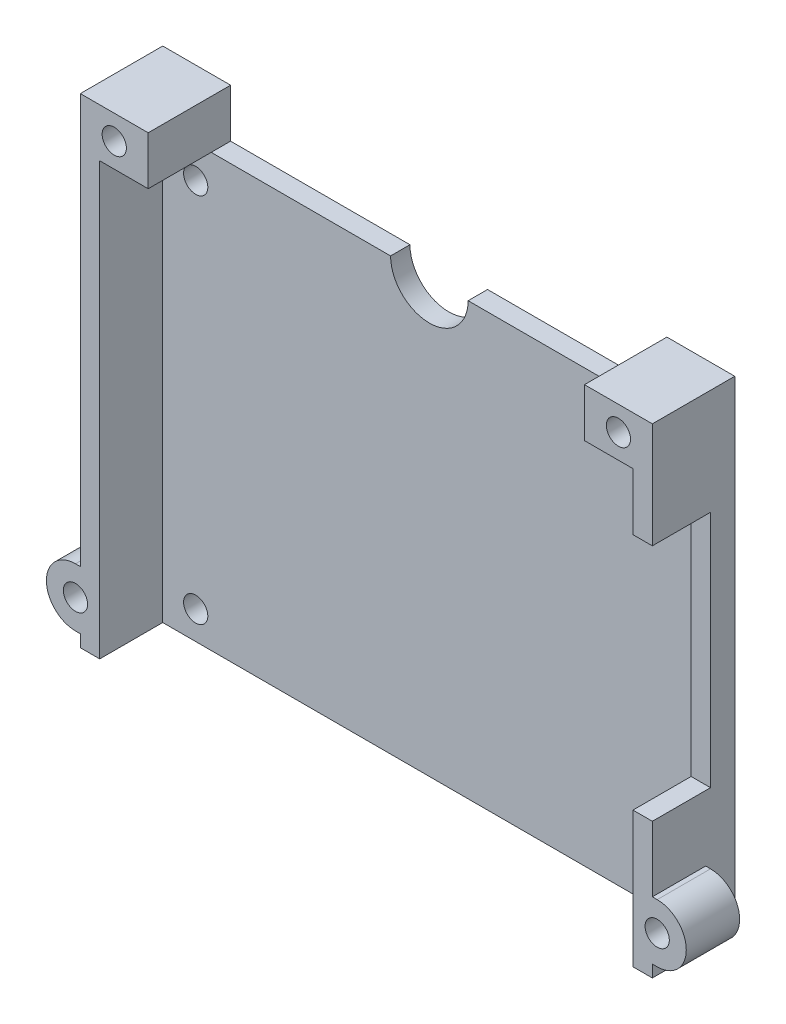
ISO-10303-21;
HEADER;
FILE_DESCRIPTION(('STEP AP214'),'2;1');
FILE_NAME('part.step','',(''),(''),'','','');
FILE_SCHEMA(('AUTOMOTIVE_DESIGN { 1 0 10303 214 1 1 1 1 }'));
ENDSEC;
DATA;
#1=APPLICATION_CONTEXT('core data for automotive mechanical design processes');
#2=APPLICATION_PROTOCOL_DEFINITION('international standard','automotive_design',2000,#1);
#3=PRODUCT_CONTEXT('',#1,'mechanical');
#4=PRODUCT('Part','Part','',(#3));
#5=PRODUCT_RELATED_PRODUCT_CATEGORY('part','',(#4));
#6=PRODUCT_DEFINITION_FORMATION('','',#4);
#7=PRODUCT_DEFINITION_CONTEXT('part definition',#1,'design');
#8=PRODUCT_DEFINITION('design','',#6,#7);
#9=PRODUCT_DEFINITION_SHAPE('','',#8);
#10=(LENGTH_UNIT() NAMED_UNIT(*) SI_UNIT(.MILLI.,.METRE.));
#11=(NAMED_UNIT(*) PLANE_ANGLE_UNIT() SI_UNIT($,.RADIAN.));
#12=(NAMED_UNIT(*) SI_UNIT($,.STERADIAN.) SOLID_ANGLE_UNIT());
#13=UNCERTAINTY_MEASURE_WITH_UNIT(LENGTH_MEASURE(1.E-05),#10,'distance_accuracy_value','');
#14=(GEOMETRIC_REPRESENTATION_CONTEXT(3) GLOBAL_UNCERTAINTY_ASSIGNED_CONTEXT((#13)) GLOBAL_UNIT_ASSIGNED_CONTEXT((#10,
#11,#12)) REPRESENTATION_CONTEXT('',''));
#15=CARTESIAN_POINT('',(0.,0.,0.));
#16=DIRECTION('',(0.,0.,1.));
#17=DIRECTION('',(1.,0.,0.));
#18=AXIS2_PLACEMENT_3D('',#15,#16,#17);
#19=CARTESIAN_POINT('',(59.5,4.25,0.));
#20=DIRECTION('',(0.,0.,-1.));
#21=DIRECTION('',(-1.,0.,0.));
#22=AXIS2_PLACEMENT_3D('',#19,#20,#21);
#23=CYLINDRICAL_SURFACE('',#22,1.25000000000001);
#24=CARTESIAN_POINT('',(59.5,4.25,0.));
#25=DIRECTION('',(0.,0.,-1.));
#26=DIRECTION('',(-1.,0.,0.));
#27=AXIS2_PLACEMENT_3D('',#24,#25,#26);
#28=CIRCLE('',#27,1.25000000000001);
#29=CARTESIAN_POINT('',(58.25,4.25,0.));
#30=VERTEX_POINT('',#29);
#31=EDGE_CURVE('E441',#30,#30,#28,.T.);
#32=ORIENTED_EDGE('',*,*,#31,.F.);
#33=EDGE_LOOP('',(#32));
#34=FACE_BOUND('',#33,.T.);
#35=CARTESIAN_POINT('',(59.5,4.25,-5.5));
#36=DIRECTION('',(0.,0.,-1.));
#37=DIRECTION('',(-1.,0.,0.));
#38=AXIS2_PLACEMENT_3D('',#35,#36,#37);
#39=CIRCLE('',#38,1.25000000000001);
#40=CARTESIAN_POINT('',(59.,3.10435607626103,-5.5));
#41=VERTEX_POINT('',#40);
#42=CARTESIAN_POINT('',(59.,5.39564392373897,-5.5));
#43=VERTEX_POINT('',#42);
#44=EDGE_CURVE('E249',#41,#43,#39,.T.);
#45=ORIENTED_EDGE('',*,*,#44,.T.);
#46=CARTESIAN_POINT('',(59.5,4.25,-5.5));
#47=DIRECTION('',(0.,0.,-1.));
#48=DIRECTION('',(-1.,0.,0.));
#49=AXIS2_PLACEMENT_3D('',#46,#47,#48);
#50=CIRCLE('',#49,1.25000000000001);
#51=EDGE_CURVE('E258',#43,#41,#50,.T.);
#52=ORIENTED_EDGE('',*,*,#51,.T.);
#53=EDGE_LOOP('',(#45,#52));
#54=FACE_BOUND('',#53,.T.);
#55=ADVANCED_FACE('F45',(#34,#54),#23,.F.);
#56=CARTESIAN_POINT('',(-0.5,4.25,0.));
#57=DIRECTION('',(0.,0.,-1.));
#58=DIRECTION('',(-1.,0.,0.));
#59=AXIS2_PLACEMENT_3D('',#56,#57,#58);
#60=CYLINDRICAL_SURFACE('',#59,1.25);
#61=CARTESIAN_POINT('',(-0.5,4.25,0.));
#62=DIRECTION('',(0.,0.,-1.));
#63=DIRECTION('',(-1.,0.,0.));
#64=AXIS2_PLACEMENT_3D('',#61,#62,#63);
#65=CIRCLE('',#64,1.25);
#66=CARTESIAN_POINT('',(-1.75,4.25,0.));
#67=VERTEX_POINT('',#66);
#68=EDGE_CURVE('E422',#67,#67,#65,.T.);
#69=ORIENTED_EDGE('',*,*,#68,.F.);
#70=EDGE_LOOP('',(#69));
#71=FACE_BOUND('',#70,.T.);
#72=CARTESIAN_POINT('',(-0.5,4.25,-5.5));
#73=DIRECTION('',(0.,0.,-1.));
#74=DIRECTION('',(-1.,0.,0.));
#75=AXIS2_PLACEMENT_3D('',#72,#73,#74);
#76=CIRCLE('',#75,1.25);
#77=CARTESIAN_POINT('',(0.,5.39564392373896,-5.5));
#78=VERTEX_POINT('',#77);
#79=CARTESIAN_POINT('',(0.,3.10435607626104,-5.5));
#80=VERTEX_POINT('',#79);
#81=EDGE_CURVE('E274',#78,#80,#76,.T.);
#82=ORIENTED_EDGE('',*,*,#81,.T.);
#83=CARTESIAN_POINT('',(-0.5,4.25,-5.5));
#84=DIRECTION('',(0.,0.,-1.));
#85=DIRECTION('',(-1.,0.,0.));
#86=AXIS2_PLACEMENT_3D('',#83,#84,#85);
#87=CIRCLE('',#86,1.25);
#88=EDGE_CURVE('E284',#80,#78,#87,.T.);
#89=ORIENTED_EDGE('',*,*,#88,.T.);
#90=EDGE_LOOP('',(#82,#89));
#91=FACE_BOUND('',#90,.T.);
#92=ADVANCED_FACE('F668',(#71,#91),#60,.F.);
#93=CARTESIAN_POINT('',(0.,44.5,-8.5));
#94=DIRECTION('',(0.,0.,1.));
#95=DIRECTION('',(1.,0.,0.));
#96=AXIS2_PLACEMENT_3D('',#93,#94,#95);
#97=PLANE('',#96);
#98=CARTESIAN_POINT('',(53.6,2.9,-8.5));
#99=DIRECTION('',(0.,0.,-1.));
#100=DIRECTION('',(-1.,0.,0.));
#101=AXIS2_PLACEMENT_3D('',#98,#99,#100);
#102=CIRCLE('',#101,1.25);
#103=CARTESIAN_POINT('',(52.35,2.9,-8.5));
#104=VERTEX_POINT('',#103);
#105=EDGE_CURVE('E310',#104,#104,#102,.T.);
#106=ORIENTED_EDGE('',*,*,#105,.F.);
#107=EDGE_LOOP('',(#106));
#108=FACE_BOUND('',#107,.T.);
#109=CARTESIAN_POINT('',(5.4,2.90000000000001,-8.5));
#110=DIRECTION('',(0.,0.,-1.));
#111=DIRECTION('',(-1.,0.,0.));
#112=AXIS2_PLACEMENT_3D('',#109,#110,#111);
#113=CIRCLE('',#112,1.25);
#114=CARTESIAN_POINT('',(4.15,2.90000000000001,-8.5));
#115=VERTEX_POINT('',#114);
#116=EDGE_CURVE('E316',#115,#115,#113,.T.);
#117=ORIENTED_EDGE('',*,*,#116,.F.);
#118=EDGE_LOOP('',(#117));
#119=FACE_BOUND('',#118,.T.);
#120=CARTESIAN_POINT('',(5.4,41.2,-8.5));
#121=DIRECTION('',(0.,0.,-1.));
#122=DIRECTION('',(-1.,0.,0.));
#123=AXIS2_PLACEMENT_3D('',#120,#121,#122);
#124=CIRCLE('',#123,1.25);
#125=CARTESIAN_POINT('',(4.15,41.2,-8.5));
#126=VERTEX_POINT('',#125);
#127=EDGE_CURVE('E311',#126,#126,#124,.T.);
#128=ORIENTED_EDGE('',*,*,#127,.F.);
#129=EDGE_LOOP('',(#128));
#130=FACE_BOUND('',#129,.T.);
#131=CARTESIAN_POINT('',(53.6,41.2,-8.5));
#132=DIRECTION('',(0.,0.,-1.));
#133=DIRECTION('',(-1.,0.,0.));
#134=AXIS2_PLACEMENT_3D('',#131,#132,#133);
#135=CIRCLE('',#134,1.25);
#136=CARTESIAN_POINT('',(52.35,41.2,-8.5));
#137=VERTEX_POINT('',#136);
#138=EDGE_CURVE('E315',#137,#137,#135,.T.);
#139=ORIENTED_EDGE('',*,*,#138,.F.);
#140=EDGE_LOOP('',(#139));
#141=FACE_BOUND('',#140,.T.);
#142=CARTESIAN_POINT('',(55.5,47.,-8.5));
#143=DIRECTION('',(0.,0.,-1.));
#144=DIRECTION('',(-1.,0.,0.));
#145=AXIS2_PLACEMENT_3D('',#142,#143,#144);
#146=CIRCLE('',#145,1.25);
#147=CARTESIAN_POINT('',(54.25,47.,-8.5));
#148=VERTEX_POINT('',#147);
#149=EDGE_CURVE('E348',#148,#148,#146,.T.);
#150=ORIENTED_EDGE('',*,*,#149,.F.);
#151=EDGE_LOOP('',(#150));
#152=FACE_BOUND('',#151,.T.);
#153=CARTESIAN_POINT('',(3.5,47.,-8.5));
#154=DIRECTION('',(0.,0.,-1.));
#155=DIRECTION('',(-1.,0.,0.));
#156=AXIS2_PLACEMENT_3D('',#153,#154,#155);
#157=CIRCLE('',#156,1.25);
#158=CARTESIAN_POINT('',(2.25,47.,-8.5));
#159=VERTEX_POINT('',#158);
#160=EDGE_CURVE('E352',#159,#159,#157,.T.);
#161=ORIENTED_EDGE('',*,*,#160,.F.);
#162=EDGE_LOOP('',(#161));
#163=FACE_BOUND('',#162,.T.);
#164=DIRECTION('',(0.,-1.,0.));
#165=VECTOR('',#164,1.);
#166=CARTESIAN_POINT('',(59.,44.5,-8.5));
#167=LINE('',#166,#165);
#168=CARTESIAN_POINT('',(59.,49.5,-8.5));
#169=VERTEX_POINT('',#168);
#170=CARTESIAN_POINT('',(59.,0.,-8.5));
#171=VERTEX_POINT('',#170);
#172=EDGE_CURVE('E568',#169,#171,#167,.T.);
#173=ORIENTED_EDGE('',*,*,#172,.T.);
#174=DIRECTION('',(-1.,0.,0.));
#175=VECTOR('',#174,1.);
#176=CARTESIAN_POINT('',(0.,0.,-8.5));
#177=LINE('',#176,#175);
#178=CARTESIAN_POINT('',(0.,0.,-8.5));
#179=VERTEX_POINT('',#178);
#180=EDGE_CURVE('E523',#171,#179,#177,.T.);
#181=ORIENTED_EDGE('',*,*,#180,.T.);
#182=DIRECTION('',(0.,-1.,0.));
#183=VECTOR('',#182,1.);
#184=CARTESIAN_POINT('',(0.,44.5,-8.5));
#185=LINE('',#184,#183);
#186=CARTESIAN_POINT('',(0.,49.5,-8.5));
#187=VERTEX_POINT('',#186);
#188=EDGE_CURVE('E538',#187,#179,#185,.T.);
#189=ORIENTED_EDGE('',*,*,#188,.F.);
#190=DIRECTION('',(-1.,0.,0.));
#191=VECTOR('',#190,1.);
#192=CARTESIAN_POINT('',(0.,49.5,-8.5));
#193=LINE('',#192,#191);
#194=CARTESIAN_POINT('',(7.,49.5,-8.5));
#195=VERTEX_POINT('',#194);
#196=EDGE_CURVE('E405',#195,#187,#193,.T.);
#197=ORIENTED_EDGE('',*,*,#196,.F.);
#198=DIRECTION('',(0.,-1.,0.));
#199=VECTOR('',#198,1.);
#200=CARTESIAN_POINT('',(7.,49.5,-8.5));
#201=LINE('',#200,#199);
#202=CARTESIAN_POINT('',(7.,44.5,-8.5));
#203=VERTEX_POINT('',#202);
#204=EDGE_CURVE('E409',#195,#203,#201,.T.);
#205=ORIENTED_EDGE('',*,*,#204,.T.);
#206=DIRECTION('',(-1.,0.,0.));
#207=VECTOR('',#206,1.);
#208=CARTESIAN_POINT('',(0.,44.5,-8.5));
#209=LINE('',#208,#207);
#210=CARTESIAN_POINT('',(25.5,44.5,-8.5));
#211=VERTEX_POINT('',#210);
#212=EDGE_CURVE('E533',#211,#203,#209,.T.);
#213=ORIENTED_EDGE('',*,*,#212,.F.);
#214=CARTESIAN_POINT('',(29.5,44.5,-8.5));
#215=DIRECTION('',(0.,0.,1.));
#216=DIRECTION('',(1.,0.,0.));
#217=AXIS2_PLACEMENT_3D('',#214,#215,#216);
#218=CIRCLE('',#217,4.);
#219=CARTESIAN_POINT('',(33.5,44.5,-8.5));
#220=VERTEX_POINT('',#219);
#221=EDGE_CURVE('E11',#211,#220,#218,.T.);
#222=ORIENTED_EDGE('',*,*,#221,.T.);
#223=CARTESIAN_POINT('',(52.,44.5,-8.5));
#224=VERTEX_POINT('',#223);
#225=EDGE_CURVE('E534',#224,#220,#209,.T.);
#226=ORIENTED_EDGE('',*,*,#225,.F.);
#227=DIRECTION('',(0.,-1.,0.));
#228=VECTOR('',#227,1.);
#229=CARTESIAN_POINT('',(52.,49.5,-8.5));
#230=LINE('',#229,#228);
#231=CARTESIAN_POINT('',(52.,49.5,-8.5));
#232=VERTEX_POINT('',#231);
#233=EDGE_CURVE('E347',#232,#224,#230,.T.);
#234=ORIENTED_EDGE('',*,*,#233,.F.);
#235=DIRECTION('',(-1.,0.,0.));
#236=VECTOR('',#235,1.);
#237=CARTESIAN_POINT('',(59.,49.5,-8.5));
#238=LINE('',#237,#236);
#239=EDGE_CURVE('E384',#169,#232,#238,.T.);
#240=ORIENTED_EDGE('',*,*,#239,.F.);
#241=EDGE_LOOP('',(#173,#181,#189,#197,#205,#213,#222,#226,#234,#240));
#242=FACE_BOUND('',#241,.T.);
#243=ADVANCED_FACE('F618',(#108,#119,#130,#141,#152,#163,#242),#97,.F.);
#244=CARTESIAN_POINT('',(0.,1.25,0.));
#245=DIRECTION('',(0.,1.,0.));
#246=DIRECTION('',(0.,0.,1.));
#247=AXIS2_PLACEMENT_3D('',#244,#245,#246);
#248=PLANE('',#247);
#249=DIRECTION('',(1.,0.,0.));
#250=VECTOR('',#249,1.);
#251=CARTESIAN_POINT('',(0.,1.25,-5.5));
#252=LINE('',#251,#250);
#253=CARTESIAN_POINT('',(59.,1.25,-5.5));
#254=VERTEX_POINT('',#253);
#255=CARTESIAN_POINT('',(59.5,1.25,-5.5));
#256=VERTEX_POINT('',#255);
#257=EDGE_CURVE('E260',#254,#256,#252,.T.);
#258=ORIENTED_EDGE('',*,*,#257,.T.);
#259=DIRECTION('',(0.,0.,-1.));
#260=VECTOR('',#259,1.);
#261=CARTESIAN_POINT('',(59.5,1.25,0.));
#262=LINE('',#261,#260);
#263=CARTESIAN_POINT('',(59.5,1.25,0.));
#264=VERTEX_POINT('',#263);
#265=EDGE_CURVE('E472',#264,#256,#262,.T.);
#266=ORIENTED_EDGE('',*,*,#265,.F.);
#267=DIRECTION('',(1.,0.,0.));
#268=VECTOR('',#267,1.);
#269=CARTESIAN_POINT('',(0.,1.25,0.));
#270=LINE('',#269,#268);
#271=CARTESIAN_POINT('',(59.,1.25,0.));
#272=VERTEX_POINT('',#271);
#273=EDGE_CURVE('E464',#272,#264,#270,.T.);
#274=ORIENTED_EDGE('',*,*,#273,.F.);
#275=DIRECTION('',(0.,0.,-1.));
#276=VECTOR('',#275,1.);
#277=CARTESIAN_POINT('',(59.,1.25,0.));
#278=LINE('',#277,#276);
#279=EDGE_CURVE('E468',#272,#254,#278,.T.);
#280=ORIENTED_EDGE('',*,*,#279,.T.);
#281=EDGE_LOOP('',(#258,#266,#274,#280));
#282=FACE_BOUND('',#281,.T.);
#283=ADVANCED_FACE('F703',(#282),#248,.F.);
#284=CARTESIAN_POINT('',(59.5,4.25,0.));
#285=DIRECTION('',(0.,0.,-1.));
#286=DIRECTION('',(-1.,0.,0.));
#287=AXIS2_PLACEMENT_3D('',#284,#285,#286);
#288=CYLINDRICAL_SURFACE('',#287,3.);
#289=ORIENTED_EDGE('',*,*,#265,.T.);
#290=CARTESIAN_POINT('',(59.5,4.25,-5.5));
#291=DIRECTION('',(0.,0.,-1.));
#292=DIRECTION('',(-1.,0.,0.));
#293=AXIS2_PLACEMENT_3D('',#290,#291,#292);
#294=CIRCLE('',#293,3.);
#295=CARTESIAN_POINT('',(59.5,7.25,-5.5));
#296=VERTEX_POINT('',#295);
#297=EDGE_CURVE('E279',#296,#256,#294,.T.);
#298=ORIENTED_EDGE('',*,*,#297,.F.);
#299=DIRECTION('',(0.,0.,-1.));
#300=VECTOR('',#299,1.);
#301=CARTESIAN_POINT('',(59.5,7.25,0.));
#302=LINE('',#301,#300);
#303=CARTESIAN_POINT('',(59.5,7.25,0.));
#304=VERTEX_POINT('',#303);
#305=EDGE_CURVE('E476',#304,#296,#302,.T.);
#306=ORIENTED_EDGE('',*,*,#305,.F.);
#307=CARTESIAN_POINT('',(59.5,4.25,0.));
#308=DIRECTION('',(0.,0.,-1.));
#309=DIRECTION('',(-1.,0.,0.));
#310=AXIS2_PLACEMENT_3D('',#307,#308,#309);
#311=CIRCLE('',#310,3.);
#312=EDGE_CURVE('E460',#304,#264,#311,.T.);
#313=ORIENTED_EDGE('',*,*,#312,.T.);
#314=EDGE_LOOP('',(#289,#298,#306,#313));
#315=FACE_BOUND('',#314,.T.);
#316=ADVANCED_FACE('F765',(#315),#288,.T.);
#317=CARTESIAN_POINT('',(0.,7.2499999999999,0.));
#318=DIRECTION('',(0.,1.,0.));
#319=DIRECTION('',(-1.,0.,0.));
#320=AXIS2_PLACEMENT_3D('',#317,#318,#319);
#321=PLANE('',#320);
#322=ORIENTED_EDGE('',*,*,#305,.T.);
#323=DIRECTION('',(1.,0.,0.));
#324=VECTOR('',#323,1.);
#325=CARTESIAN_POINT('',(0.,7.2499999999999,-5.5));
#326=LINE('',#325,#324);
#327=CARTESIAN_POINT('',(59.,7.25,-5.5));
#328=VERTEX_POINT('',#327);
#329=EDGE_CURVE('E270',#328,#296,#326,.T.);
#330=ORIENTED_EDGE('',*,*,#329,.F.);
#331=DIRECTION('',(0.,0.,-1.));
#332=VECTOR('',#331,1.);
#333=CARTESIAN_POINT('',(59.,7.25,0.));
#334=LINE('',#333,#332);
#335=CARTESIAN_POINT('',(59.,7.25,0.));
#336=VERTEX_POINT('',#335);
#337=EDGE_CURVE('E467',#336,#328,#334,.T.);
#338=ORIENTED_EDGE('',*,*,#337,.F.);
#339=DIRECTION('',(1.,0.,0.));
#340=VECTOR('',#339,1.);
#341=CARTESIAN_POINT('',(0.,7.2499999999999,0.));
#342=LINE('',#341,#340);
#343=EDGE_CURVE('E456',#336,#304,#342,.T.);
#344=ORIENTED_EDGE('',*,*,#343,.T.);
#345=EDGE_LOOP('',(#322,#330,#338,#344));
#346=FACE_BOUND('',#345,.T.);
#347=ADVANCED_FACE('F679',(#346),#321,.T.);
#348=CARTESIAN_POINT('',(0.,7.25,0.));
#349=DIRECTION('',(0.,-1.,0.));
#350=DIRECTION('',(0.,0.,-1.));
#351=AXIS2_PLACEMENT_3D('',#348,#349,#350);
#352=PLANE('',#351);
#353=DIRECTION('',(-1.,0.,0.));
#354=VECTOR('',#353,1.);
#355=CARTESIAN_POINT('',(0.,7.25,-5.5));
#356=LINE('',#355,#354);
#357=CARTESIAN_POINT('',(0.,7.25,-5.5));
#358=VERTEX_POINT('',#357);
#359=CARTESIAN_POINT('',(-0.5,7.25,-5.5));
#360=VERTEX_POINT('',#359);
#361=EDGE_CURVE('E271',#358,#360,#356,.T.);
#362=ORIENTED_EDGE('',*,*,#361,.T.);
#363=DIRECTION('',(0.,0.,-1.));
#364=VECTOR('',#363,1.);
#365=CARTESIAN_POINT('',(-0.5,7.25,0.));
#366=LINE('',#365,#364);
#367=CARTESIAN_POINT('',(-0.5,7.25,0.));
#368=VERTEX_POINT('',#367);
#369=EDGE_CURVE('E442',#368,#360,#366,.T.);
#370=ORIENTED_EDGE('',*,*,#369,.F.);
#371=DIRECTION('',(-1.,0.,0.));
#372=VECTOR('',#371,1.);
#373=CARTESIAN_POINT('',(0.,7.25,0.));
#374=LINE('',#373,#372);
#375=CARTESIAN_POINT('',(0.,7.25,0.));
#376=VERTEX_POINT('',#375);
#377=EDGE_CURVE('E433',#376,#368,#374,.T.);
#378=ORIENTED_EDGE('',*,*,#377,.F.);
#379=DIRECTION('',(0.,0.,-1.));
#380=VECTOR('',#379,1.);
#381=CARTESIAN_POINT('',(0.,7.25,0.));
#382=LINE('',#381,#380);
#383=EDGE_CURVE('E437',#376,#358,#382,.T.);
#384=ORIENTED_EDGE('',*,*,#383,.T.);
#385=EDGE_LOOP('',(#362,#370,#378,#384));
#386=FACE_BOUND('',#385,.T.);
#387=ADVANCED_FACE('F781',(#386),#352,.F.);
#388=CARTESIAN_POINT('',(-0.5,4.25,0.));
#389=DIRECTION('',(0.,0.,-1.));
#390=DIRECTION('',(-1.,0.,0.));
#391=AXIS2_PLACEMENT_3D('',#388,#389,#390);
#392=CYLINDRICAL_SURFACE('',#391,3.);
#393=CARTESIAN_POINT('',(-0.5,4.25,-5.5));
#394=DIRECTION('',(0.,0.,-1.));
#395=DIRECTION('',(-1.,0.,0.));
#396=AXIS2_PLACEMENT_3D('',#393,#394,#395);
#397=CIRCLE('',#396,3.);
#398=CARTESIAN_POINT('',(-0.5,1.25,-5.5));
#399=VERTEX_POINT('',#398);
#400=EDGE_CURVE('E292',#360,#399,#397,.F.);
#401=ORIENTED_EDGE('',*,*,#400,.T.);
#402=DIRECTION('',(0.,0.,-1.));
#403=VECTOR('',#402,1.);
#404=CARTESIAN_POINT('',(-0.5,1.25,0.));
#405=LINE('',#404,#403);
#406=CARTESIAN_POINT('',(-0.5,1.25,0.));
#407=VERTEX_POINT('',#406);
#408=EDGE_CURVE('E446',#407,#399,#405,.T.);
#409=ORIENTED_EDGE('',*,*,#408,.F.);
#410=CARTESIAN_POINT('',(-0.5,4.25,0.));
#411=DIRECTION('',(0.,0.,-1.));
#412=DIRECTION('',(-1.,0.,0.));
#413=AXIS2_PLACEMENT_3D('',#410,#411,#412);
#414=CIRCLE('',#413,3.);
#415=EDGE_CURVE('E430',#368,#407,#414,.F.);
#416=ORIENTED_EDGE('',*,*,#415,.F.);
#417=ORIENTED_EDGE('',*,*,#369,.T.);
#418=EDGE_LOOP('',(#401,#409,#416,#417));
#419=FACE_BOUND('',#418,.T.);
#420=ADVANCED_FACE('F777',(#419),#392,.T.);
#421=CARTESIAN_POINT('',(0.,1.25,0.));
#422=DIRECTION('',(0.,-1.,0.));
#423=DIRECTION('',(0.,0.,-1.));
#424=AXIS2_PLACEMENT_3D('',#421,#422,#423);
#425=PLANE('',#424);
#426=ORIENTED_EDGE('',*,*,#408,.T.);
#427=DIRECTION('',(-1.,0.,0.));
#428=VECTOR('',#427,1.);
#429=CARTESIAN_POINT('',(0.,1.25,-5.5));
#430=LINE('',#429,#428);
#431=CARTESIAN_POINT('',(0.,1.25,-5.5));
#432=VERTEX_POINT('',#431);
#433=EDGE_CURVE('E289',#432,#399,#430,.T.);
#434=ORIENTED_EDGE('',*,*,#433,.F.);
#435=DIRECTION('',(0.,0.,-1.));
#436=VECTOR('',#435,1.);
#437=CARTESIAN_POINT('',(0.,1.25,0.));
#438=LINE('',#437,#436);
#439=CARTESIAN_POINT('',(0.,1.25,0.));
#440=VERTEX_POINT('',#439);
#441=EDGE_CURVE('E436',#440,#432,#438,.T.);
#442=ORIENTED_EDGE('',*,*,#441,.F.);
#443=DIRECTION('',(-1.,0.,0.));
#444=VECTOR('',#443,1.);
#445=CARTESIAN_POINT('',(0.,1.25,0.));
#446=LINE('',#445,#444);
#447=EDGE_CURVE('E426',#440,#407,#446,.T.);
#448=ORIENTED_EDGE('',*,*,#447,.T.);
#449=EDGE_LOOP('',(#426,#434,#442,#448));
#450=FACE_BOUND('',#449,.T.);
#451=ADVANCED_FACE('F774',(#450),#425,.T.);
#452=CARTESIAN_POINT('',(0.,44.5,0.));
#453=DIRECTION('',(0.,-1.,0.));
#454=DIRECTION('',(0.,0.,-1.));
#455=AXIS2_PLACEMENT_3D('',#452,#453,#454);
#456=PLANE('',#455);
#457=DIRECTION('',(1.,0.,0.));
#458=VECTOR('',#457,1.);
#459=CARTESIAN_POINT('',(2.,44.5,-6.5));
#460=LINE('',#459,#458);
#461=CARTESIAN_POINT('',(7.,44.5,-6.5));
#462=VERTEX_POINT('',#461);
#463=CARTESIAN_POINT('',(25.5,44.5,-6.5));
#464=VERTEX_POINT('',#463);
#465=EDGE_CURVE('E529',#462,#464,#460,.T.);
#466=ORIENTED_EDGE('',*,*,#465,.T.);
#467=DIRECTION('',(0.,0.,-1.));
#468=VECTOR('',#467,1.);
#469=CARTESIAN_POINT('',(25.5,44.5,0.));
#470=LINE('',#469,#468);
#471=EDGE_CURVE('E306',#464,#211,#470,.T.);
#472=ORIENTED_EDGE('',*,*,#471,.T.);
#473=ORIENTED_EDGE('',*,*,#212,.T.);
#474=DIRECTION('',(0.,0.,-1.));
#475=VECTOR('',#474,1.);
#476=CARTESIAN_POINT('',(7.,44.5,0.));
#477=LINE('',#476,#475);
#478=EDGE_CURVE('E54',#462,#203,#477,.T.);
#479=ORIENTED_EDGE('',*,*,#478,.F.);
#480=EDGE_LOOP('',(#466,#472,#473,#479));
#481=FACE_BOUND('',#480,.T.);
#482=ADVANCED_FACE('F697',(#481),#456,.F.);
#483=ORIENTED_EDGE('',*,*,#225,.T.);
#484=DIRECTION('',(0.,0.,-1.));
#485=VECTOR('',#484,1.);
#486=CARTESIAN_POINT('',(33.5,44.5,0.));
#487=LINE('',#486,#485);
#488=CARTESIAN_POINT('',(33.5,44.5,-6.5));
#489=VERTEX_POINT('',#488);
#490=EDGE_CURVE('E302',#220,#489,#487,.F.);
#491=ORIENTED_EDGE('',*,*,#490,.T.);
#492=CARTESIAN_POINT('',(52.,44.5,-6.5));
#493=VERTEX_POINT('',#492);
#494=EDGE_CURVE('E522',#489,#493,#460,.T.);
#495=ORIENTED_EDGE('',*,*,#494,.T.);
#496=DIRECTION('',(0.,0.,1.));
#497=VECTOR('',#496,1.);
#498=CARTESIAN_POINT('',(52.,44.5,0.));
#499=LINE('',#498,#497);
#500=EDGE_CURVE('E373',#224,#493,#499,.T.);
#501=ORIENTED_EDGE('',*,*,#500,.F.);
#502=EDGE_LOOP('',(#483,#491,#495,#501));
#503=FACE_BOUND('',#502,.T.);
#504=ADVANCED_FACE('F693',(#503),#456,.F.);
#505=CARTESIAN_POINT('',(57.,44.5,0.));
#506=DIRECTION('',(0.,0.,-1.));
#507=DIRECTION('',(-1.,0.,0.));
#508=AXIS2_PLACEMENT_3D('',#505,#506,#507);
#509=PLANE('',#508);
#510=CARTESIAN_POINT('',(55.5,47.,0.));
#511=DIRECTION('',(0.,0.,-1.));
#512=DIRECTION('',(-1.,0.,0.));
#513=AXIS2_PLACEMENT_3D('',#510,#511,#512);
#514=CIRCLE('',#513,1.25);
#515=CARTESIAN_POINT('',(54.25,47.,0.));
#516=VERTEX_POINT('',#515);
#517=EDGE_CURVE('E343',#516,#516,#514,.T.);
#518=ORIENTED_EDGE('',*,*,#517,.T.);
#519=EDGE_LOOP('',(#518));
#520=FACE_BOUND('',#519,.T.);
#521=DIRECTION('',(0.,-1.,0.));
#522=VECTOR('',#521,1.);
#523=CARTESIAN_POINT('',(57.,44.5,0.));
#524=LINE('',#523,#522);
#525=CARTESIAN_POINT('',(57.,44.5,0.));
#526=VERTEX_POINT('',#525);
#527=CARTESIAN_POINT('',(57.,38.6,0.));
#528=VERTEX_POINT('',#527);
#529=EDGE_CURVE('E578',#526,#528,#524,.T.);
#530=ORIENTED_EDGE('',*,*,#529,.T.);
#531=DIRECTION('',(1.,0.,0.));
#532=VECTOR('',#531,1.);
#533=CARTESIAN_POINT('',(49.,38.6,0.));
#534=LINE('',#533,#532);
#535=CARTESIAN_POINT('',(59.,38.6,0.));
#536=VERTEX_POINT('',#535);
#537=EDGE_CURVE('E493',#528,#536,#534,.T.);
#538=ORIENTED_EDGE('',*,*,#537,.T.);
#539=DIRECTION('',(0.,-1.,0.));
#540=VECTOR('',#539,1.);
#541=CARTESIAN_POINT('',(59.,44.5,0.));
#542=LINE('',#541,#540);
#543=CARTESIAN_POINT('',(59.,49.5,0.));
#544=VERTEX_POINT('',#543);
#545=EDGE_CURVE('E572',#544,#536,#542,.T.);
#546=ORIENTED_EDGE('',*,*,#545,.F.);
#547=DIRECTION('',(1.,0.,0.));
#548=VECTOR('',#547,1.);
#549=CARTESIAN_POINT('',(59.,49.5,0.));
#550=LINE('',#549,#548);
#551=CARTESIAN_POINT('',(52.,49.5,0.));
#552=VERTEX_POINT('',#551);
#553=EDGE_CURVE('E366',#552,#544,#550,.T.);
#554=ORIENTED_EDGE('',*,*,#553,.F.);
#555=DIRECTION('',(0.,-1.,0.));
#556=VECTOR('',#555,1.);
#557=CARTESIAN_POINT('',(52.,49.5,0.));
#558=LINE('',#557,#556);
#559=CARTESIAN_POINT('',(52.,44.5,0.));
#560=VERTEX_POINT('',#559);
#561=EDGE_CURVE('E362',#552,#560,#558,.T.);
#562=ORIENTED_EDGE('',*,*,#561,.T.);
#563=DIRECTION('',(1.,0.,0.));
#564=VECTOR('',#563,1.);
#565=CARTESIAN_POINT('',(59.,44.5,0.));
#566=LINE('',#565,#564);
#567=EDGE_CURVE('E367',#560,#526,#566,.T.);
#568=ORIENTED_EDGE('',*,*,#567,.T.);
#569=EDGE_LOOP('',(#530,#538,#546,#554,#562,#568));
#570=FACE_BOUND('',#569,.T.);
#571=ADVANCED_FACE('F696',(#520,#570),#509,.F.);
#572=CARTESIAN_POINT('',(0.,44.5,0.));
#573=DIRECTION('',(1.,0.,0.));
#574=DIRECTION('',(0.,0.,-1.));
#575=AXIS2_PLACEMENT_3D('',#572,#573,#574);
#576=PLANE('',#575);
#577=DIRECTION('',(0.,-1.,0.));
#578=VECTOR('',#577,1.);
#579=CARTESIAN_POINT('',(0.,44.5,0.));
#580=LINE('',#579,#578);
#581=CARTESIAN_POINT('',(0.,0.,0.));
#582=VERTEX_POINT('',#581);
#583=EDGE_CURVE('E593',#440,#582,#580,.T.);
#584=ORIENTED_EDGE('',*,*,#583,.F.);
#585=ORIENTED_EDGE('',*,*,#441,.T.);
#586=DIRECTION('',(0.,1.,0.));
#587=VECTOR('',#586,1.);
#588=CARTESIAN_POINT('',(0.,0.,-5.5));
#589=LINE('',#588,#587);
#590=EDGE_CURVE('E69',#432,#80,#589,.T.);
#591=ORIENTED_EDGE('',*,*,#590,.T.);
#592=DIRECTION('',(0.,1.,0.));
#593=VECTOR('',#592,1.);
#594=CARTESIAN_POINT('',(0.,0.,-5.5));
#595=LINE('',#594,#593);
#596=EDGE_CURVE('E255',#80,#78,#595,.T.);
#597=ORIENTED_EDGE('',*,*,#596,.T.);
#598=EDGE_CURVE('E266',#78,#358,#589,.T.);
#599=ORIENTED_EDGE('',*,*,#598,.T.);
#600=ORIENTED_EDGE('',*,*,#383,.F.);
#601=CARTESIAN_POINT('',(0.,49.5,0.));
#602=VERTEX_POINT('',#601);
#603=EDGE_CURVE('E594',#602,#376,#580,.T.);
#604=ORIENTED_EDGE('',*,*,#603,.F.);
#605=DIRECTION('',(0.,0.,1.));
#606=VECTOR('',#605,1.);
#607=CARTESIAN_POINT('',(0.,49.5,0.));
#608=LINE('',#607,#606);
#609=EDGE_CURVE('E394',#187,#602,#608,.T.);
#610=ORIENTED_EDGE('',*,*,#609,.F.);
#611=ORIENTED_EDGE('',*,*,#188,.T.);
#612=DIRECTION('',(0.,0.,1.));
#613=VECTOR('',#612,1.);
#614=CARTESIAN_POINT('',(0.,0.,0.));
#615=LINE('',#614,#613);
#616=EDGE_CURVE('E517',#179,#582,#615,.T.);
#617=ORIENTED_EDGE('',*,*,#616,.T.);
#618=EDGE_LOOP('',(#584,#585,#591,#597,#599,#600,#604,#610,#611,#617));
#619=FACE_BOUND('',#618,.T.);
#620=ADVANCED_FACE('F47',(#619),#576,.F.);
#621=CARTESIAN_POINT('',(0.,44.5,0.));
#622=DIRECTION('',(0.,0.,-1.));
#623=DIRECTION('',(-1.,0.,0.));
#624=AXIS2_PLACEMENT_3D('',#621,#622,#623);
#625=PLANE('',#624);
#626=CARTESIAN_POINT('',(3.5,47.,0.));
#627=DIRECTION('',(0.,0.,-1.));
#628=DIRECTION('',(-1.,0.,0.));
#629=AXIS2_PLACEMENT_3D('',#626,#627,#628);
#630=CIRCLE('',#629,1.25);
#631=CARTESIAN_POINT('',(2.25,47.,0.));
#632=VERTEX_POINT('',#631);
#633=EDGE_CURVE('E342',#632,#632,#630,.T.);
#634=ORIENTED_EDGE('',*,*,#633,.T.);
#635=EDGE_LOOP('',(#634));
#636=FACE_BOUND('',#635,.T.);
#637=ORIENTED_EDGE('',*,*,#603,.T.);
#638=ORIENTED_EDGE('',*,*,#377,.T.);
#639=ORIENTED_EDGE('',*,*,#415,.T.);
#640=ORIENTED_EDGE('',*,*,#447,.F.);
#641=ORIENTED_EDGE('',*,*,#583,.T.);
#642=DIRECTION('',(1.,0.,0.));
#643=VECTOR('',#642,1.);
#644=CARTESIAN_POINT('',(0.,0.,0.));
#645=LINE('',#644,#643);
#646=CARTESIAN_POINT('',(2.,0.,0.));
#647=VERTEX_POINT('',#646);
#648=EDGE_CURVE('E542',#582,#647,#645,.T.);
#649=ORIENTED_EDGE('',*,*,#648,.T.);
#650=DIRECTION('',(0.,-1.,0.));
#651=VECTOR('',#650,1.);
#652=CARTESIAN_POINT('',(2.,44.5,0.));
#653=LINE('',#652,#651);
#654=CARTESIAN_POINT('',(2.,44.5,0.));
#655=VERTEX_POINT('',#654);
#656=EDGE_CURVE('E590',#655,#647,#653,.T.);
#657=ORIENTED_EDGE('',*,*,#656,.F.);
#658=DIRECTION('',(1.,0.,0.));
#659=VECTOR('',#658,1.);
#660=CARTESIAN_POINT('',(0.,44.5,0.));
#661=LINE('',#660,#659);
#662=CARTESIAN_POINT('',(7.,44.5,0.));
#663=VERTEX_POINT('',#662);
#664=EDGE_CURVE('E393',#655,#663,#661,.T.);
#665=ORIENTED_EDGE('',*,*,#664,.T.);
#666=DIRECTION('',(0.,-1.,0.));
#667=VECTOR('',#666,1.);
#668=CARTESIAN_POINT('',(7.,49.5,0.));
#669=LINE('',#668,#667);
#670=CARTESIAN_POINT('',(7.,49.5,0.));
#671=VERTEX_POINT('',#670);
#672=EDGE_CURVE('E418',#671,#663,#669,.T.);
#673=ORIENTED_EDGE('',*,*,#672,.F.);
#674=DIRECTION('',(1.,0.,0.));
#675=VECTOR('',#674,1.);
#676=CARTESIAN_POINT('',(0.,49.5,0.));
#677=LINE('',#676,#675);
#678=EDGE_CURVE('E398',#602,#671,#677,.T.);
#679=ORIENTED_EDGE('',*,*,#678,.F.);
#680=EDGE_LOOP('',(#637,#638,#639,#640,#641,#649,#657,#665,#673,#679));
#681=FACE_BOUND('',#680,.T.);
#682=ORIENTED_EDGE('',*,*,#68,.T.);
#683=EDGE_LOOP('',(#682));
#684=FACE_BOUND('',#683,.T.);
#685=ADVANCED_FACE('F605',(#636,#681,#684),#625,.F.);
#686=CARTESIAN_POINT('',(2.,44.5,0.));
#687=DIRECTION('',(-1.,0.,0.));
#688=DIRECTION('',(0.,0.,1.));
#689=AXIS2_PLACEMENT_3D('',#686,#687,#688);
#690=PLANE('',#689);
#691=DIRECTION('',(0.,0.,-1.));
#692=VECTOR('',#691,1.);
#693=CARTESIAN_POINT('',(2.,0.,0.));
#694=LINE('',#693,#692);
#695=CARTESIAN_POINT('',(2.,0.,-6.5));
#696=VERTEX_POINT('',#695);
#697=EDGE_CURVE('E545',#647,#696,#694,.T.);
#698=ORIENTED_EDGE('',*,*,#697,.T.);
#699=DIRECTION('',(0.,-1.,0.));
#700=VECTOR('',#699,1.);
#701=CARTESIAN_POINT('',(2.,44.5,-6.5));
#702=LINE('',#701,#700);
#703=CARTESIAN_POINT('',(2.,44.5,-6.5));
#704=VERTEX_POINT('',#703);
#705=EDGE_CURVE('E586',#704,#696,#702,.T.);
#706=ORIENTED_EDGE('',*,*,#705,.F.);
#707=DIRECTION('',(0.,0.,-1.));
#708=VECTOR('',#707,1.);
#709=CARTESIAN_POINT('',(2.,44.5,0.));
#710=LINE('',#709,#708);
#711=EDGE_CURVE('E518',#655,#704,#710,.T.);
#712=ORIENTED_EDGE('',*,*,#711,.F.);
#713=ORIENTED_EDGE('',*,*,#656,.T.);
#714=EDGE_LOOP('',(#698,#706,#712,#713));
#715=FACE_BOUND('',#714,.T.);
#716=ADVANCED_FACE('F643',(#715),#690,.F.);
#717=CARTESIAN_POINT('',(2.,44.5,-6.5));
#718=DIRECTION('',(0.,0.,-1.));
#719=DIRECTION('',(-1.,0.,0.));
#720=AXIS2_PLACEMENT_3D('',#717,#718,#719);
#721=PLANE('',#720);
#722=CARTESIAN_POINT('',(53.6,2.9,-6.5));
#723=DIRECTION('',(0.,0.,-1.));
#724=DIRECTION('',(-1.,0.,0.));
#725=AXIS2_PLACEMENT_3D('',#722,#723,#724);
#726=CIRCLE('',#725,1.25);
#727=CARTESIAN_POINT('',(52.35,2.9,-6.5));
#728=VERTEX_POINT('',#727);
#729=EDGE_CURVE('E338',#728,#728,#726,.T.);
#730=ORIENTED_EDGE('',*,*,#729,.T.);
#731=EDGE_LOOP('',(#730));
#732=FACE_BOUND('',#731,.T.);
#733=CARTESIAN_POINT('',(5.4,2.90000000000001,-6.5));
#734=DIRECTION('',(0.,0.,-1.));
#735=DIRECTION('',(-1.,0.,0.));
#736=AXIS2_PLACEMENT_3D('',#733,#734,#735);
#737=CIRCLE('',#736,1.25);
#738=CARTESIAN_POINT('',(4.15,2.90000000000001,-6.5));
#739=VERTEX_POINT('',#738);
#740=EDGE_CURVE('E334',#739,#739,#737,.T.);
#741=ORIENTED_EDGE('',*,*,#740,.T.);
#742=EDGE_LOOP('',(#741));
#743=FACE_BOUND('',#742,.T.);
#744=CARTESIAN_POINT('',(5.4,41.2,-6.5));
#745=DIRECTION('',(0.,0.,-1.));
#746=DIRECTION('',(-1.,0.,0.));
#747=AXIS2_PLACEMENT_3D('',#744,#745,#746);
#748=CIRCLE('',#747,1.25);
#749=CARTESIAN_POINT('',(4.15,41.2,-6.5));
#750=VERTEX_POINT('',#749);
#751=EDGE_CURVE('E330',#750,#750,#748,.T.);
#752=ORIENTED_EDGE('',*,*,#751,.T.);
#753=EDGE_LOOP('',(#752));
#754=FACE_BOUND('',#753,.T.);
#755=CARTESIAN_POINT('',(53.6,41.2,-6.5));
#756=DIRECTION('',(0.,0.,-1.));
#757=DIRECTION('',(-1.,0.,0.));
#758=AXIS2_PLACEMENT_3D('',#755,#756,#757);
#759=CIRCLE('',#758,1.25);
#760=CARTESIAN_POINT('',(52.35,41.2,-6.5));
#761=VERTEX_POINT('',#760);
#762=EDGE_CURVE('E326',#761,#761,#759,.T.);
#763=ORIENTED_EDGE('',*,*,#762,.T.);
#764=EDGE_LOOP('',(#763));
#765=FACE_BOUND('',#764,.T.);
#766=ORIENTED_EDGE('',*,*,#494,.F.);
#767=CARTESIAN_POINT('',(29.5,44.5,-6.5));
#768=DIRECTION('',(0.,0.,-1.));
#769=DIRECTION('',(-1.,0.,0.));
#770=AXIS2_PLACEMENT_3D('',#767,#768,#769);
#771=CIRCLE('',#770,4.);
#772=EDGE_CURVE('E263',#489,#464,#771,.T.);
#773=ORIENTED_EDGE('',*,*,#772,.T.);
#774=ORIENTED_EDGE('',*,*,#465,.F.);
#775=EDGE_CURVE('E524',#704,#462,#460,.T.);
#776=ORIENTED_EDGE('',*,*,#775,.F.);
#777=ORIENTED_EDGE('',*,*,#705,.T.);
#778=DIRECTION('',(1.,0.,0.));
#779=VECTOR('',#778,1.);
#780=CARTESIAN_POINT('',(2.,0.,-6.5));
#781=LINE('',#780,#779);
#782=CARTESIAN_POINT('',(57.,0.,-6.5));
#783=VERTEX_POINT('',#782);
#784=EDGE_CURVE('E548',#696,#783,#781,.T.);
#785=ORIENTED_EDGE('',*,*,#784,.T.);
#786=DIRECTION('',(0.,-1.,0.));
#787=VECTOR('',#786,1.);
#788=CARTESIAN_POINT('',(57.,44.5,-6.5));
#789=LINE('',#788,#787);
#790=CARTESIAN_POINT('',(57.,44.5,-6.5));
#791=VERTEX_POINT('',#790);
#792=EDGE_CURVE('E582',#791,#783,#789,.T.);
#793=ORIENTED_EDGE('',*,*,#792,.F.);
#794=DIRECTION('',(1.,0.,0.));
#795=VECTOR('',#794,1.);
#796=CARTESIAN_POINT('',(2.,44.5,-6.5));
#797=LINE('',#796,#795);
#798=EDGE_CURVE('E377',#493,#791,#797,.T.);
#799=ORIENTED_EDGE('',*,*,#798,.F.);
#800=EDGE_LOOP('',(#766,#773,#774,#776,#777,#785,#793,#799));
#801=FACE_BOUND('',#800,.T.);
#802=ADVANCED_FACE('F637',(#732,#743,#754,#765,#801),#721,.F.);
#803=CARTESIAN_POINT('',(57.,44.5,-6.5));
#804=DIRECTION('',(1.,0.,0.));
#805=DIRECTION('',(0.,0.,-1.));
#806=AXIS2_PLACEMENT_3D('',#803,#804,#805);
#807=PLANE('',#806);
#808=DIRECTION('',(0.,1.,0.));
#809=VECTOR('',#808,1.);
#810=CARTESIAN_POINT('',(57.,44.5,-6.));
#811=LINE('',#810,#809);
#812=CARTESIAN_POINT('',(57.,14.,-6.));
#813=VERTEX_POINT('',#812);
#814=CARTESIAN_POINT('',(57.,38.6,-6.));
#815=VERTEX_POINT('',#814);
#816=EDGE_CURVE('E509',#813,#815,#811,.T.);
#817=ORIENTED_EDGE('',*,*,#816,.T.);
#818=DIRECTION('',(0.,0.,1.));
#819=VECTOR('',#818,1.);
#820=CARTESIAN_POINT('',(57.,38.6,-6.5));
#821=LINE('',#820,#819);
#822=EDGE_CURVE('E513',#815,#528,#821,.T.);
#823=ORIENTED_EDGE('',*,*,#822,.T.);
#824=ORIENTED_EDGE('',*,*,#529,.F.);
#825=DIRECTION('',(0.,0.,1.));
#826=VECTOR('',#825,1.);
#827=CARTESIAN_POINT('',(57.,44.5,-6.5));
#828=LINE('',#827,#826);
#829=EDGE_CURVE('E528',#791,#526,#828,.T.);
#830=ORIENTED_EDGE('',*,*,#829,.F.);
#831=ORIENTED_EDGE('',*,*,#792,.T.);
#832=DIRECTION('',(0.,0.,1.));
#833=VECTOR('',#832,1.);
#834=CARTESIAN_POINT('',(57.,0.,-6.5));
#835=LINE('',#834,#833);
#836=CARTESIAN_POINT('',(57.,0.,0.));
#837=VERTEX_POINT('',#836);
#838=EDGE_CURVE('E551',#783,#837,#835,.T.);
#839=ORIENTED_EDGE('',*,*,#838,.T.);
#840=CARTESIAN_POINT('',(57.,14.,0.));
#841=VERTEX_POINT('',#840);
#842=EDGE_CURVE('E576',#841,#837,#524,.T.);
#843=ORIENTED_EDGE('',*,*,#842,.F.);
#844=DIRECTION('',(0.,0.,-1.));
#845=VECTOR('',#844,1.);
#846=CARTESIAN_POINT('',(57.,14.,-6.5));
#847=LINE('',#846,#845);
#848=EDGE_CURVE('E497',#841,#813,#847,.T.);
#849=ORIENTED_EDGE('',*,*,#848,.T.);
#850=EDGE_LOOP('',(#817,#823,#824,#830,#831,#839,#843,#849));
#851=FACE_BOUND('',#850,.T.);
#852=ADVANCED_FACE('F633',(#851),#807,.F.);
#853=ORIENTED_EDGE('',*,*,#31,.T.);
#854=EDGE_LOOP('',(#853));
#855=FACE_BOUND('',#854,.T.);
#856=CARTESIAN_POINT('',(59.,14.,0.));
#857=VERTEX_POINT('',#856);
#858=EDGE_CURVE('E577',#857,#336,#542,.T.);
#859=ORIENTED_EDGE('',*,*,#858,.F.);
#860=DIRECTION('',(1.,0.,0.));
#861=VECTOR('',#860,1.);
#862=CARTESIAN_POINT('',(49.,14.,0.));
#863=LINE('',#862,#861);
#864=EDGE_CURVE('E492',#841,#857,#863,.T.);
#865=ORIENTED_EDGE('',*,*,#864,.F.);
#866=ORIENTED_EDGE('',*,*,#842,.T.);
#867=DIRECTION('',(1.,0.,0.));
#868=VECTOR('',#867,1.);
#869=CARTESIAN_POINT('',(57.,0.,0.));
#870=LINE('',#869,#868);
#871=CARTESIAN_POINT('',(59.,0.,0.));
#872=VERTEX_POINT('',#871);
#873=EDGE_CURVE('E555',#837,#872,#870,.T.);
#874=ORIENTED_EDGE('',*,*,#873,.T.);
#875=EDGE_CURVE('E571',#272,#872,#542,.T.);
#876=ORIENTED_EDGE('',*,*,#875,.F.);
#877=ORIENTED_EDGE('',*,*,#273,.T.);
#878=ORIENTED_EDGE('',*,*,#312,.F.);
#879=ORIENTED_EDGE('',*,*,#343,.F.);
#880=EDGE_LOOP('',(#859,#865,#866,#874,#876,#877,#878,#879));
#881=FACE_BOUND('',#880,.T.);
#882=ADVANCED_FACE('F628',(#855,#881),#509,.F.);
#883=CARTESIAN_POINT('',(59.,44.5,0.));
#884=DIRECTION('',(-1.,0.,0.));
#885=DIRECTION('',(0.,0.,1.));
#886=AXIS2_PLACEMENT_3D('',#883,#884,#885);
#887=PLANE('',#886);
#888=ORIENTED_EDGE('',*,*,#858,.T.);
#889=ORIENTED_EDGE('',*,*,#337,.T.);
#890=DIRECTION('',(0.,-1.,0.));
#891=VECTOR('',#890,1.);
#892=CARTESIAN_POINT('',(59.,0.,-5.5));
#893=LINE('',#892,#891);
#894=EDGE_CURVE('E61',#328,#43,#893,.T.);
#895=ORIENTED_EDGE('',*,*,#894,.T.);
#896=DIRECTION('',(0.,-1.,0.));
#897=VECTOR('',#896,1.);
#898=CARTESIAN_POINT('',(59.,0.,-5.5));
#899=LINE('',#898,#897);
#900=EDGE_CURVE('E237',#43,#41,#899,.T.);
#901=ORIENTED_EDGE('',*,*,#900,.T.);
#902=EDGE_CURVE('E243',#41,#254,#893,.T.);
#903=ORIENTED_EDGE('',*,*,#902,.T.);
#904=ORIENTED_EDGE('',*,*,#279,.F.);
#905=ORIENTED_EDGE('',*,*,#875,.T.);
#906=DIRECTION('',(0.,0.,-1.));
#907=VECTOR('',#906,1.);
#908=CARTESIAN_POINT('',(59.,0.,0.));
#909=LINE('',#908,#907);
#910=EDGE_CURVE('E559',#872,#171,#909,.T.);
#911=ORIENTED_EDGE('',*,*,#910,.T.);
#912=ORIENTED_EDGE('',*,*,#172,.F.);
#913=DIRECTION('',(0.,0.,-1.));
#914=VECTOR('',#913,1.);
#915=CARTESIAN_POINT('',(59.,49.5,0.));
#916=LINE('',#915,#914);
#917=EDGE_CURVE('E372',#544,#169,#916,.T.);
#918=ORIENTED_EDGE('',*,*,#917,.F.);
#919=ORIENTED_EDGE('',*,*,#545,.T.);
#920=DIRECTION('',(0.,0.,1.));
#921=VECTOR('',#920,1.);
#922=CARTESIAN_POINT('',(59.,38.6,-6.));
#923=LINE('',#922,#921);
#924=CARTESIAN_POINT('',(59.,38.6,-6.));
#925=VERTEX_POINT('',#924);
#926=EDGE_CURVE('E489',#925,#536,#923,.T.);
#927=ORIENTED_EDGE('',*,*,#926,.F.);
#928=DIRECTION('',(0.,1.,0.));
#929=VECTOR('',#928,1.);
#930=CARTESIAN_POINT('',(59.,14.,-6.));
#931=LINE('',#930,#929);
#932=CARTESIAN_POINT('',(59.,14.,-6.));
#933=VERTEX_POINT('',#932);
#934=EDGE_CURVE('E485',#933,#925,#931,.T.);
#935=ORIENTED_EDGE('',*,*,#934,.F.);
#936=DIRECTION('',(0.,0.,-1.));
#937=VECTOR('',#936,1.);
#938=CARTESIAN_POINT('',(59.,14.,0.));
#939=LINE('',#938,#937);
#940=EDGE_CURVE('E471',#857,#933,#939,.T.);
#941=ORIENTED_EDGE('',*,*,#940,.F.);
#942=EDGE_LOOP('',(#888,#889,#895,#901,#903,#904,#905,#911,#912,#918,#919,#927,#935,#941));
#943=FACE_BOUND('',#942,.T.);
#944=ADVANCED_FACE('F240',(#943),#887,.F.);
#945=CARTESIAN_POINT('',(0.,0.,0.));
#946=DIRECTION('',(0.,-1.,0.));
#947=DIRECTION('',(0.,0.,-1.));
#948=AXIS2_PLACEMENT_3D('',#945,#946,#947);
#949=PLANE('',#948);
#950=ORIENTED_EDGE('',*,*,#616,.F.);
#951=ORIENTED_EDGE('',*,*,#180,.F.);
#952=ORIENTED_EDGE('',*,*,#910,.F.);
#953=ORIENTED_EDGE('',*,*,#873,.F.);
#954=ORIENTED_EDGE('',*,*,#838,.F.);
#955=ORIENTED_EDGE('',*,*,#784,.F.);
#956=ORIENTED_EDGE('',*,*,#697,.F.);
#957=ORIENTED_EDGE('',*,*,#648,.F.);
#958=EDGE_LOOP('',(#950,#951,#952,#953,#954,#955,#956,#957));
#959=FACE_BOUND('',#958,.T.);
#960=ADVANCED_FACE('F612',(#959),#949,.T.);
#961=CARTESIAN_POINT('',(49.,38.6,-6.));
#962=DIRECTION('',(0.,1.,0.));
#963=DIRECTION('',(0.,0.,1.));
#964=AXIS2_PLACEMENT_3D('',#961,#962,#963);
#965=PLANE('',#964);
#966=DIRECTION('',(1.,0.,0.));
#967=VECTOR('',#966,1.);
#968=CARTESIAN_POINT('',(49.,38.6,-6.));
#969=LINE('',#968,#967);
#970=EDGE_CURVE('E498',#815,#925,#969,.T.);
#971=ORIENTED_EDGE('',*,*,#970,.T.);
#972=ORIENTED_EDGE('',*,*,#926,.T.);
#973=ORIENTED_EDGE('',*,*,#537,.F.);
#974=ORIENTED_EDGE('',*,*,#822,.F.);
#975=EDGE_LOOP('',(#971,#972,#973,#974));
#976=FACE_BOUND('',#975,.T.);
#977=ADVANCED_FACE('F681',(#976),#965,.F.);
#978=CARTESIAN_POINT('',(49.,14.,-6.));
#979=DIRECTION('',(0.,0.,-1.));
#980=DIRECTION('',(-1.,0.,0.));
#981=AXIS2_PLACEMENT_3D('',#978,#979,#980);
#982=PLANE('',#981);
#983=DIRECTION('',(1.,0.,0.));
#984=VECTOR('',#983,1.);
#985=CARTESIAN_POINT('',(49.,14.,-6.));
#986=LINE('',#985,#984);
#987=EDGE_CURVE('E501',#813,#933,#986,.T.);
#988=ORIENTED_EDGE('',*,*,#987,.T.);
#989=ORIENTED_EDGE('',*,*,#934,.T.);
#990=ORIENTED_EDGE('',*,*,#970,.F.);
#991=ORIENTED_EDGE('',*,*,#816,.F.);
#992=EDGE_LOOP('',(#988,#989,#990,#991));
#993=FACE_BOUND('',#992,.T.);
#994=ADVANCED_FACE('F684',(#993),#982,.F.);
#995=CARTESIAN_POINT('',(49.,14.,0.));
#996=DIRECTION('',(0.,-1.,0.));
#997=DIRECTION('',(0.,0.,-1.));
#998=AXIS2_PLACEMENT_3D('',#995,#996,#997);
#999=PLANE('',#998);
#1000=ORIENTED_EDGE('',*,*,#864,.T.);
#1001=ORIENTED_EDGE('',*,*,#940,.T.);
#1002=ORIENTED_EDGE('',*,*,#987,.F.);
#1003=ORIENTED_EDGE('',*,*,#848,.F.);
#1004=EDGE_LOOP('',(#1000,#1001,#1002,#1003));
#1005=FACE_BOUND('',#1004,.T.);
#1006=ADVANCED_FACE('F688',(#1005),#999,.F.);
#1007=CARTESIAN_POINT('',(7.,49.5,0.));
#1008=DIRECTION('',(-1.,0.,0.));
#1009=DIRECTION('',(0.,0.,1.));
#1010=AXIS2_PLACEMENT_3D('',#1007,#1008,#1009);
#1011=PLANE('',#1010);
#1012=EDGE_CURVE('E399',#663,#462,#477,.T.);
#1013=ORIENTED_EDGE('',*,*,#1012,.T.);
#1014=ORIENTED_EDGE('',*,*,#478,.T.);
#1015=ORIENTED_EDGE('',*,*,#204,.F.);
#1016=DIRECTION('',(0.,0.,-1.));
#1017=VECTOR('',#1016,1.);
#1018=CARTESIAN_POINT('',(7.,49.5,0.));
#1019=LINE('',#1018,#1017);
#1020=EDGE_CURVE('E402',#671,#195,#1019,.T.);
#1021=ORIENTED_EDGE('',*,*,#1020,.F.);
#1022=ORIENTED_EDGE('',*,*,#672,.T.);
#1023=EDGE_LOOP('',(#1013,#1014,#1015,#1021,#1022));
#1024=FACE_BOUND('',#1023,.T.);
#1025=ADVANCED_FACE('F650',(#1024),#1011,.F.);
#1026=CARTESIAN_POINT('',(0.,49.5,0.));
#1027=DIRECTION('',(0.,-1.,0.));
#1028=DIRECTION('',(0.,0.,-1.));
#1029=AXIS2_PLACEMENT_3D('',#1026,#1027,#1028);
#1030=PLANE('',#1029);
#1031=ORIENTED_EDGE('',*,*,#609,.T.);
#1032=ORIENTED_EDGE('',*,*,#678,.T.);
#1033=ORIENTED_EDGE('',*,*,#1020,.T.);
#1034=ORIENTED_EDGE('',*,*,#196,.T.);
#1035=EDGE_LOOP('',(#1031,#1032,#1033,#1034));
#1036=FACE_BOUND('',#1035,.T.);
#1037=ADVANCED_FACE('F655',(#1036),#1030,.F.);
#1038=CARTESIAN_POINT('',(0.,44.5,0.));
#1039=DIRECTION('',(0.,-1.,0.));
#1040=DIRECTION('',(0.,0.,-1.));
#1041=AXIS2_PLACEMENT_3D('',#1038,#1039,#1040);
#1042=PLANE('',#1041);
#1043=ORIENTED_EDGE('',*,*,#664,.F.);
#1044=ORIENTED_EDGE('',*,*,#711,.T.);
#1045=ORIENTED_EDGE('',*,*,#775,.T.);
#1046=ORIENTED_EDGE('',*,*,#1012,.F.);
#1047=EDGE_LOOP('',(#1043,#1044,#1045,#1046));
#1048=FACE_BOUND('',#1047,.T.);
#1049=ADVANCED_FACE('F652',(#1048),#1042,.T.);
#1050=CARTESIAN_POINT('',(0.,44.5,0.));
#1051=DIRECTION('',(0.,1.,0.));
#1052=DIRECTION('',(0.,0.,1.));
#1053=AXIS2_PLACEMENT_3D('',#1050,#1051,#1052);
#1054=PLANE('',#1053);
#1055=EDGE_CURVE('E371',#493,#560,#499,.T.);
#1056=ORIENTED_EDGE('',*,*,#1055,.F.);
#1057=ORIENTED_EDGE('',*,*,#798,.T.);
#1058=ORIENTED_EDGE('',*,*,#829,.T.);
#1059=ORIENTED_EDGE('',*,*,#567,.F.);
#1060=EDGE_LOOP('',(#1056,#1057,#1058,#1059));
#1061=FACE_BOUND('',#1060,.T.);
#1062=ADVANCED_FACE('F654',(#1061),#1054,.F.);
#1063=CARTESIAN_POINT('',(52.,49.5,0.));
#1064=DIRECTION('',(1.,0.,0.));
#1065=DIRECTION('',(0.,0.,-1.));
#1066=AXIS2_PLACEMENT_3D('',#1063,#1064,#1065);
#1067=PLANE('',#1066);
#1068=ORIENTED_EDGE('',*,*,#500,.T.);
#1069=ORIENTED_EDGE('',*,*,#1055,.T.);
#1070=ORIENTED_EDGE('',*,*,#561,.F.);
#1071=DIRECTION('',(0.,0.,1.));
#1072=VECTOR('',#1071,1.);
#1073=CARTESIAN_POINT('',(52.,49.5,0.));
#1074=LINE('',#1073,#1072);
#1075=EDGE_CURVE('E381',#232,#552,#1074,.T.);
#1076=ORIENTED_EDGE('',*,*,#1075,.F.);
#1077=ORIENTED_EDGE('',*,*,#233,.T.);
#1078=EDGE_LOOP('',(#1068,#1069,#1070,#1076,#1077));
#1079=FACE_BOUND('',#1078,.T.);
#1080=ADVANCED_FACE('F661',(#1079),#1067,.F.);
#1081=CARTESIAN_POINT('',(0.,49.5,0.));
#1082=DIRECTION('',(0.,1.,0.));
#1083=DIRECTION('',(0.,0.,1.));
#1084=AXIS2_PLACEMENT_3D('',#1081,#1082,#1083);
#1085=PLANE('',#1084);
#1086=ORIENTED_EDGE('',*,*,#917,.T.);
#1087=ORIENTED_EDGE('',*,*,#239,.T.);
#1088=ORIENTED_EDGE('',*,*,#1075,.T.);
#1089=ORIENTED_EDGE('',*,*,#553,.T.);
#1090=EDGE_LOOP('',(#1086,#1087,#1088,#1089));
#1091=FACE_BOUND('',#1090,.T.);
#1092=ADVANCED_FACE('F727',(#1091),#1085,.T.);
#1093=CARTESIAN_POINT('',(3.5,47.,0.));
#1094=DIRECTION('',(0.,0.,-1.));
#1095=DIRECTION('',(-1.,0.,0.));
#1096=AXIS2_PLACEMENT_3D('',#1093,#1094,#1095);
#1097=CYLINDRICAL_SURFACE('',#1096,1.25);
#1098=ORIENTED_EDGE('',*,*,#633,.F.);
#1099=EDGE_LOOP('',(#1098));
#1100=FACE_BOUND('',#1099,.T.);
#1101=ORIENTED_EDGE('',*,*,#160,.T.);
#1102=EDGE_LOOP('',(#1101));
#1103=FACE_BOUND('',#1102,.T.);
#1104=ADVANCED_FACE('F723',(#1100,#1103),#1097,.F.);
#1105=CARTESIAN_POINT('',(55.5,47.,0.));
#1106=DIRECTION('',(0.,0.,-1.));
#1107=DIRECTION('',(-1.,0.,0.));
#1108=AXIS2_PLACEMENT_3D('',#1105,#1106,#1107);
#1109=CYLINDRICAL_SURFACE('',#1108,1.25);
#1110=ORIENTED_EDGE('',*,*,#517,.F.);
#1111=EDGE_LOOP('',(#1110));
#1112=FACE_BOUND('',#1111,.T.);
#1113=ORIENTED_EDGE('',*,*,#149,.T.);
#1114=EDGE_LOOP('',(#1113));
#1115=FACE_BOUND('',#1114,.T.);
#1116=ADVANCED_FACE('F726',(#1112,#1115),#1109,.F.);
#1117=CARTESIAN_POINT('',(53.6,41.2,1.5));
#1118=DIRECTION('',(0.,0.,-1.));
#1119=DIRECTION('',(-1.,0.,0.));
#1120=AXIS2_PLACEMENT_3D('',#1117,#1118,#1119);
#1121=CYLINDRICAL_SURFACE('',#1120,1.25);
#1122=ORIENTED_EDGE('',*,*,#138,.T.);
#1123=EDGE_LOOP('',(#1122));
#1124=FACE_BOUND('',#1123,.T.);
#1125=ORIENTED_EDGE('',*,*,#762,.F.);
#1126=EDGE_LOOP('',(#1125));
#1127=FACE_BOUND('',#1126,.T.);
#1128=ADVANCED_FACE('F735',(#1124,#1127),#1121,.F.);
#1129=CARTESIAN_POINT('',(5.4,41.2,1.5));
#1130=DIRECTION('',(0.,0.,-1.));
#1131=DIRECTION('',(-1.,0.,0.));
#1132=AXIS2_PLACEMENT_3D('',#1129,#1130,#1131);
#1133=CYLINDRICAL_SURFACE('',#1132,1.25);
#1134=ORIENTED_EDGE('',*,*,#127,.T.);
#1135=EDGE_LOOP('',(#1134));
#1136=FACE_BOUND('',#1135,.T.);
#1137=ORIENTED_EDGE('',*,*,#751,.F.);
#1138=EDGE_LOOP('',(#1137));
#1139=FACE_BOUND('',#1138,.T.);
#1140=ADVANCED_FACE('F857',(#1136,#1139),#1133,.F.);
#1141=CARTESIAN_POINT('',(5.4,2.90000000000001,1.5));
#1142=DIRECTION('',(0.,0.,-1.));
#1143=DIRECTION('',(-1.,0.,0.));
#1144=AXIS2_PLACEMENT_3D('',#1141,#1142,#1143);
#1145=CYLINDRICAL_SURFACE('',#1144,1.25);
#1146=ORIENTED_EDGE('',*,*,#116,.T.);
#1147=EDGE_LOOP('',(#1146));
#1148=FACE_BOUND('',#1147,.T.);
#1149=ORIENTED_EDGE('',*,*,#740,.F.);
#1150=EDGE_LOOP('',(#1149));
#1151=FACE_BOUND('',#1150,.T.);
#1152=ADVANCED_FACE('F867',(#1148,#1151),#1145,.F.);
#1153=CARTESIAN_POINT('',(53.6,2.9,1.5));
#1154=DIRECTION('',(0.,0.,-1.));
#1155=DIRECTION('',(-1.,0.,0.));
#1156=AXIS2_PLACEMENT_3D('',#1153,#1154,#1155);
#1157=CYLINDRICAL_SURFACE('',#1156,1.25);
#1158=ORIENTED_EDGE('',*,*,#105,.T.);
#1159=EDGE_LOOP('',(#1158));
#1160=FACE_BOUND('',#1159,.T.);
#1161=ORIENTED_EDGE('',*,*,#729,.F.);
#1162=EDGE_LOOP('',(#1161));
#1163=FACE_BOUND('',#1162,.T.);
#1164=ADVANCED_FACE('F878',(#1160,#1163),#1157,.F.);
#1165=CARTESIAN_POINT('',(29.5,44.5,0.));
#1166=DIRECTION('',(0.,0.,-1.));
#1167=DIRECTION('',(-1.,0.,0.));
#1168=AXIS2_PLACEMENT_3D('',#1165,#1166,#1167);
#1169=CYLINDRICAL_SURFACE('',#1168,4.);
#1170=ORIENTED_EDGE('',*,*,#772,.F.);
#1171=ORIENTED_EDGE('',*,*,#490,.F.);
#1172=ORIENTED_EDGE('',*,*,#221,.F.);
#1173=ORIENTED_EDGE('',*,*,#471,.F.);
#1174=EDGE_LOOP('',(#1170,#1171,#1172,#1173));
#1175=FACE_BOUND('',#1174,.T.);
#1176=ADVANCED_FACE('F889',(#1175),#1169,.F.);
#1177=CARTESIAN_POINT('',(0.,0.,-5.5));
#1178=DIRECTION('',(0.,0.,-1.));
#1179=DIRECTION('',(-1.,0.,0.));
#1180=AXIS2_PLACEMENT_3D('',#1177,#1178,#1179);
#1181=PLANE('',#1180);
#1182=ORIENTED_EDGE('',*,*,#88,.F.);
#1183=ORIENTED_EDGE('',*,*,#590,.F.);
#1184=ORIENTED_EDGE('',*,*,#433,.T.);
#1185=ORIENTED_EDGE('',*,*,#400,.F.);
#1186=ORIENTED_EDGE('',*,*,#361,.F.);
#1187=ORIENTED_EDGE('',*,*,#598,.F.);
#1188=EDGE_LOOP('',(#1182,#1183,#1184,#1185,#1186,#1187));
#1189=FACE_BOUND('',#1188,.T.);
#1190=ADVANCED_FACE('F924',(#1189),#1181,.T.);
#1191=CARTESIAN_POINT('',(0.,0.,-5.5));
#1192=DIRECTION('',(0.,0.,-1.));
#1193=DIRECTION('',(-1.,0.,0.));
#1194=AXIS2_PLACEMENT_3D('',#1191,#1192,#1193);
#1195=PLANE('',#1194);
#1196=ORIENTED_EDGE('',*,*,#51,.F.);
#1197=ORIENTED_EDGE('',*,*,#894,.F.);
#1198=ORIENTED_EDGE('',*,*,#329,.T.);
#1199=ORIENTED_EDGE('',*,*,#297,.T.);
#1200=ORIENTED_EDGE('',*,*,#257,.F.);
#1201=ORIENTED_EDGE('',*,*,#902,.F.);
#1202=EDGE_LOOP('',(#1196,#1197,#1198,#1199,#1200,#1201));
#1203=FACE_BOUND('',#1202,.T.);
#1204=ADVANCED_FACE('F257',(#1203),#1195,.T.);
#1205=CARTESIAN_POINT('',(0.,0.,-5.5));
#1206=DIRECTION('',(0.,0.,-1.));
#1207=DIRECTION('',(-1.,0.,0.));
#1208=AXIS2_PLACEMENT_3D('',#1205,#1206,#1207);
#1209=PLANE('',#1208);
#1210=ORIENTED_EDGE('',*,*,#596,.F.);
#1211=ORIENTED_EDGE('',*,*,#81,.F.);
#1212=EDGE_LOOP('',(#1210,#1211));
#1213=FACE_BOUND('',#1212,.T.);
#1214=ADVANCED_FACE('F1017',(#1213),#1209,.F.);
#1215=CARTESIAN_POINT('',(0.,0.,-5.5));
#1216=DIRECTION('',(0.,0.,-1.));
#1217=DIRECTION('',(-1.,0.,0.));
#1218=AXIS2_PLACEMENT_3D('',#1215,#1216,#1217);
#1219=PLANE('',#1218);
#1220=ORIENTED_EDGE('',*,*,#900,.F.);
#1221=ORIENTED_EDGE('',*,*,#44,.F.);
#1222=EDGE_LOOP('',(#1220,#1221));
#1223=FACE_BOUND('',#1222,.T.);
#1224=ADVANCED_FACE('F251',(#1223),#1219,.F.);
#1225=CLOSED_SHELL('',(#55,#92,#243,#283,#316,#347,#387,#420,#451,#482,#504,#571,#620,#685,#716,
#802,#852,#882,#944,#960,#977,#994,#1006,#1025,#1037,#1049,#1062,#1080,#1092,#1104,#1116,#1128,
#1140,#1152,#1164,#1176,#1190,#1204,#1214,#1224));
#1226=MANIFOLD_SOLID_BREP('B2',#1225);
#1227=ADVANCED_BREP_SHAPE_REPRESENTATION('',(#18,#1226),#14);
#1228=SHAPE_DEFINITION_REPRESENTATION(#9,#1227);
ENDSEC;
END-ISO-10303-21;
